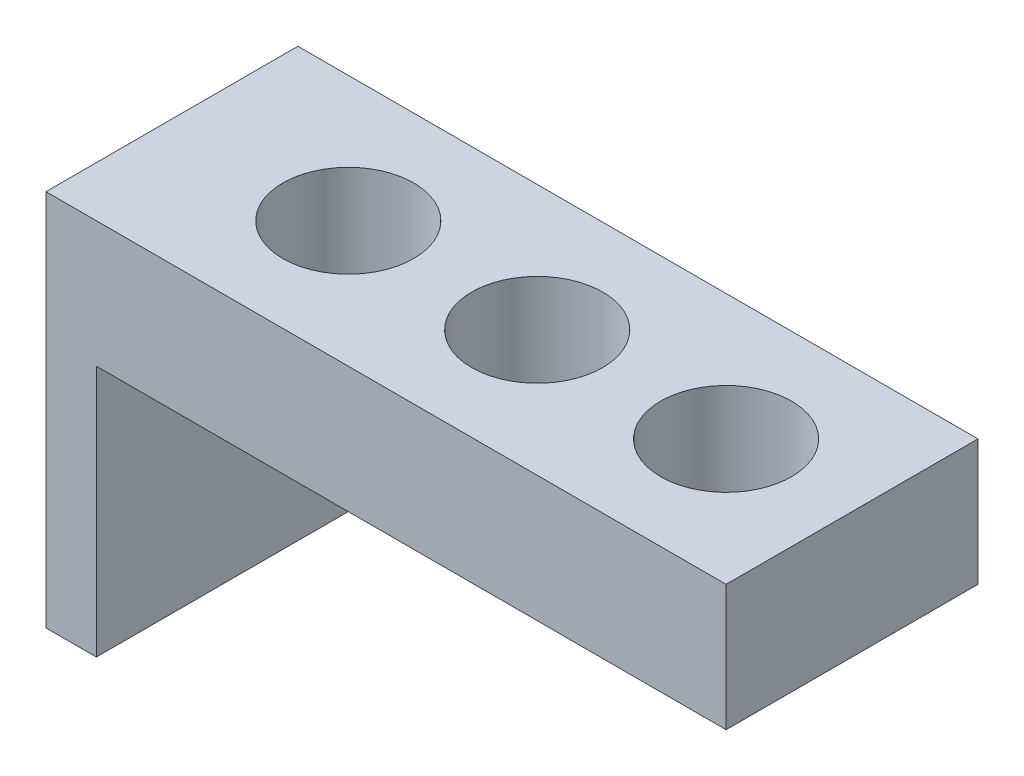
ISO-10303-21;
HEADER;
FILE_DESCRIPTION(('STEP AP214'),'2;1');
FILE_NAME('part.step','',(''),(''),'','','');
FILE_SCHEMA(('AUTOMOTIVE_DESIGN { 1 0 10303 214 1 1 1 1 }'));
ENDSEC;
DATA;
#1=APPLICATION_CONTEXT('core data for automotive mechanical design processes');
#2=APPLICATION_PROTOCOL_DEFINITION('international standard','automotive_design',2000,#1);
#3=PRODUCT_CONTEXT('',#1,'mechanical');
#4=PRODUCT('Part','Part','',(#3));
#5=PRODUCT_RELATED_PRODUCT_CATEGORY('part','',(#4));
#6=PRODUCT_DEFINITION_FORMATION('','',#4);
#7=PRODUCT_DEFINITION_CONTEXT('part definition',#1,'design');
#8=PRODUCT_DEFINITION('design','',#6,#7);
#9=PRODUCT_DEFINITION_SHAPE('','',#8);
#10=(LENGTH_UNIT() NAMED_UNIT(*) SI_UNIT(.MILLI.,.METRE.));
#11=(NAMED_UNIT(*) PLANE_ANGLE_UNIT() SI_UNIT($,.RADIAN.));
#12=(NAMED_UNIT(*) SI_UNIT($,.STERADIAN.) SOLID_ANGLE_UNIT());
#13=UNCERTAINTY_MEASURE_WITH_UNIT(LENGTH_MEASURE(1.E-05),#10,'distance_accuracy_value','');
#14=(GEOMETRIC_REPRESENTATION_CONTEXT(3) GLOBAL_UNCERTAINTY_ASSIGNED_CONTEXT((#13)) GLOBAL_UNIT_ASSIGNED_CONTEXT((#10,
#11,#12)) REPRESENTATION_CONTEXT('',''));
#15=CARTESIAN_POINT('',(0.,0.,0.));
#16=DIRECTION('',(0.,0.,1.));
#17=DIRECTION('',(1.,0.,0.));
#18=AXIS2_PLACEMENT_3D('',#15,#16,#17);
#19=CARTESIAN_POINT('',(0.,5.,0.));
#20=DIRECTION('',(0.,-1.,0.));
#21=DIRECTION('',(0.,0.,-1.));
#22=AXIS2_PLACEMENT_3D('',#19,#20,#21);
#23=PLANE('',#22);
#24=DIRECTION('',(0.,0.,-1.));
#25=VECTOR('',#24,1.);
#26=CARTESIAN_POINT('',(12.5,5.,5.));
#27=LINE('',#26,#25);
#28=CARTESIAN_POINT('',(12.5,5.,5.));
#29=VERTEX_POINT('',#28);
#30=CARTESIAN_POINT('',(12.5,5.,-5.));
#31=VERTEX_POINT('',#30);
#32=EDGE_CURVE('E79',#29,#31,#27,.T.);
#33=ORIENTED_EDGE('',*,*,#32,.T.);
#34=DIRECTION('',(-1.,0.,0.));
#35=VECTOR('',#34,1.);
#36=CARTESIAN_POINT('',(-12.5,5.,-5.));
#37=LINE('',#36,#35);
#38=CARTESIAN_POINT('',(-14.5,5.,-5.));
#39=VERTEX_POINT('',#38);
#40=EDGE_CURVE('E118',#31,#39,#37,.T.);
#41=ORIENTED_EDGE('',*,*,#40,.T.);
#42=DIRECTION('',(0.,0.,1.));
#43=VECTOR('',#42,1.);
#44=CARTESIAN_POINT('',(-14.5,5.,-5.));
#45=LINE('',#44,#43);
#46=CARTESIAN_POINT('',(-14.5,5.,5.));
#47=VERTEX_POINT('',#46);
#48=EDGE_CURVE('E121',#39,#47,#45,.T.);
#49=ORIENTED_EDGE('',*,*,#48,.T.);
#50=DIRECTION('',(1.,0.,0.));
#51=VECTOR('',#50,1.);
#52=CARTESIAN_POINT('',(-12.5,5.,5.));
#53=LINE('',#52,#51);
#54=EDGE_CURVE('E50',#47,#29,#53,.T.);
#55=ORIENTED_EDGE('',*,*,#54,.T.);
#56=EDGE_LOOP('',(#33,#41,#49,#55));
#57=FACE_BOUND('',#56,.T.);
#58=CARTESIAN_POINT('',(-7.5,5.,0.));
#59=DIRECTION('',(0.,1.,0.));
#60=DIRECTION('',(0.,0.,1.));
#61=AXIS2_PLACEMENT_3D('',#58,#59,#60);
#62=CIRCLE('',#61,2.6);
#63=CARTESIAN_POINT('',(-7.5,5.,2.6));
#64=VERTEX_POINT('',#63);
#65=EDGE_CURVE('E88',#64,#64,#62,.T.);
#66=ORIENTED_EDGE('',*,*,#65,.F.);
#67=EDGE_LOOP('',(#66));
#68=FACE_BOUND('',#67,.T.);
#69=CARTESIAN_POINT('',(0.,5.,0.));
#70=DIRECTION('',(0.,1.,0.));
#71=DIRECTION('',(0.,0.,1.));
#72=AXIS2_PLACEMENT_3D('',#69,#70,#71);
#73=CIRCLE('',#72,2.6);
#74=CARTESIAN_POINT('',(0.,5.,2.6));
#75=VERTEX_POINT('',#74);
#76=EDGE_CURVE('E154',#75,#75,#73,.T.);
#77=ORIENTED_EDGE('',*,*,#76,.F.);
#78=EDGE_LOOP('',(#77));
#79=FACE_BOUND('',#78,.T.);
#80=CARTESIAN_POINT('',(7.5,5.,0.));
#81=DIRECTION('',(0.,1.,0.));
#82=DIRECTION('',(0.,0.,1.));
#83=AXIS2_PLACEMENT_3D('',#80,#81,#82);
#84=CIRCLE('',#83,2.6);
#85=CARTESIAN_POINT('',(7.5,5.,2.6));
#86=VERTEX_POINT('',#85);
#87=EDGE_CURVE('E148',#86,#86,#84,.T.);
#88=ORIENTED_EDGE('',*,*,#87,.F.);
#89=EDGE_LOOP('',(#88));
#90=FACE_BOUND('',#89,.T.);
#91=ADVANCED_FACE('F33',(#57,#68,#79,#90),#23,.F.);
#92=CARTESIAN_POINT('',(0.,0.,0.));
#93=DIRECTION('',(0.,-1.,0.));
#94=DIRECTION('',(0.,0.,-1.));
#95=AXIS2_PLACEMENT_3D('',#92,#93,#94);
#96=PLANE('',#95);
#97=CARTESIAN_POINT('',(0.,0.,0.));
#98=DIRECTION('',(0.,1.,0.));
#99=DIRECTION('',(0.,0.,1.));
#100=AXIS2_PLACEMENT_3D('',#97,#98,#99);
#101=CIRCLE('',#100,2.6);
#102=CARTESIAN_POINT('',(0.,0.,2.6));
#103=VERTEX_POINT('',#102);
#104=EDGE_CURVE('E151',#103,#103,#101,.T.);
#105=ORIENTED_EDGE('',*,*,#104,.T.);
#106=EDGE_LOOP('',(#105));
#107=FACE_BOUND('',#106,.T.);
#108=DIRECTION('',(0.,0.,-1.));
#109=VECTOR('',#108,1.);
#110=CARTESIAN_POINT('',(12.5,0.,5.));
#111=LINE('',#110,#109);
#112=CARTESIAN_POINT('',(12.5,0.,5.));
#113=VERTEX_POINT('',#112);
#114=CARTESIAN_POINT('',(12.5,0.,-5.));
#115=VERTEX_POINT('',#114);
#116=EDGE_CURVE('E85',#113,#115,#111,.T.);
#117=ORIENTED_EDGE('',*,*,#116,.F.);
#118=DIRECTION('',(1.,0.,0.));
#119=VECTOR('',#118,1.);
#120=CARTESIAN_POINT('',(-12.5,0.,5.));
#121=LINE('',#120,#119);
#122=CARTESIAN_POINT('',(-12.5,0.,5.));
#123=VERTEX_POINT('',#122);
#124=EDGE_CURVE('E69',#123,#113,#121,.T.);
#125=ORIENTED_EDGE('',*,*,#124,.F.);
#126=DIRECTION('',(0.,0.,1.));
#127=VECTOR('',#126,1.);
#128=CARTESIAN_POINT('',(-12.5,0.,5.));
#129=LINE('',#128,#127);
#130=CARTESIAN_POINT('',(-12.5,0.,-5.));
#131=VERTEX_POINT('',#130);
#132=EDGE_CURVE('E80',#131,#123,#129,.T.);
#133=ORIENTED_EDGE('',*,*,#132,.F.);
#134=DIRECTION('',(-1.,0.,0.));
#135=VECTOR('',#134,1.);
#136=CARTESIAN_POINT('',(-12.5,0.,-5.));
#137=LINE('',#136,#135);
#138=EDGE_CURVE('E63',#115,#131,#137,.T.);
#139=ORIENTED_EDGE('',*,*,#138,.F.);
#140=EDGE_LOOP('',(#117,#125,#133,#139));
#141=FACE_BOUND('',#140,.T.);
#142=CARTESIAN_POINT('',(-7.5,0.,0.));
#143=DIRECTION('',(0.,1.,0.));
#144=DIRECTION('',(0.,0.,1.));
#145=AXIS2_PLACEMENT_3D('',#142,#143,#144);
#146=CIRCLE('',#145,2.6);
#147=CARTESIAN_POINT('',(-7.5,0.,2.6));
#148=VERTEX_POINT('',#147);
#149=EDGE_CURVE('E92',#148,#148,#146,.T.);
#150=ORIENTED_EDGE('',*,*,#149,.T.);
#151=EDGE_LOOP('',(#150));
#152=FACE_BOUND('',#151,.T.);
#153=CARTESIAN_POINT('',(7.5,0.,0.));
#154=DIRECTION('',(0.,1.,0.));
#155=DIRECTION('',(0.,0.,1.));
#156=AXIS2_PLACEMENT_3D('',#153,#154,#155);
#157=CIRCLE('',#156,2.6);
#158=CARTESIAN_POINT('',(7.5,0.,2.6));
#159=VERTEX_POINT('',#158);
#160=EDGE_CURVE('E146',#159,#159,#157,.T.);
#161=ORIENTED_EDGE('',*,*,#160,.T.);
#162=EDGE_LOOP('',(#161));
#163=FACE_BOUND('',#162,.T.);
#164=ADVANCED_FACE('F86',(#107,#141,#152,#163),#96,.T.);
#165=CARTESIAN_POINT('',(12.5,5.,5.));
#166=DIRECTION('',(-1.,0.,0.));
#167=DIRECTION('',(0.,0.,1.));
#168=AXIS2_PLACEMENT_3D('',#165,#166,#167);
#169=PLANE('',#168);
#170=ORIENTED_EDGE('',*,*,#116,.T.);
#171=DIRECTION('',(0.,-1.,0.));
#172=VECTOR('',#171,1.);
#173=CARTESIAN_POINT('',(12.5,5.,-5.));
#174=LINE('',#173,#172);
#175=EDGE_CURVE('E11',#31,#115,#174,.T.);
#176=ORIENTED_EDGE('',*,*,#175,.F.);
#177=ORIENTED_EDGE('',*,*,#32,.F.);
#178=DIRECTION('',(0.,-1.,0.));
#179=VECTOR('',#178,1.);
#180=CARTESIAN_POINT('',(12.5,5.,5.));
#181=LINE('',#180,#179);
#182=EDGE_CURVE('E42',#29,#113,#181,.T.);
#183=ORIENTED_EDGE('',*,*,#182,.T.);
#184=EDGE_LOOP('',(#170,#176,#177,#183));
#185=FACE_BOUND('',#184,.T.);
#186=ADVANCED_FACE('F35',(#185),#169,.F.);
#187=CARTESIAN_POINT('',(-12.5,5.,-5.));
#188=DIRECTION('',(0.,0.,1.));
#189=DIRECTION('',(1.,0.,0.));
#190=AXIS2_PLACEMENT_3D('',#187,#188,#189);
#191=PLANE('',#190);
#192=ORIENTED_EDGE('',*,*,#138,.T.);
#193=DIRECTION('',(0.,1.,0.));
#194=VECTOR('',#193,1.);
#195=CARTESIAN_POINT('',(-12.5,-10.,-5.));
#196=LINE('',#195,#194);
#197=CARTESIAN_POINT('',(-12.5,-10.,-5.));
#198=VERTEX_POINT('',#197);
#199=EDGE_CURVE('E102',#198,#131,#196,.T.);
#200=ORIENTED_EDGE('',*,*,#199,.F.);
#201=DIRECTION('',(1.,0.,0.));
#202=VECTOR('',#201,1.);
#203=CARTESIAN_POINT('',(-14.5,-10.,-5.));
#204=LINE('',#203,#202);
#205=CARTESIAN_POINT('',(-14.5,-10.,-5.));
#206=VERTEX_POINT('',#205);
#207=EDGE_CURVE('E132',#206,#198,#204,.T.);
#208=ORIENTED_EDGE('',*,*,#207,.F.);
#209=DIRECTION('',(0.,-1.,0.));
#210=VECTOR('',#209,1.);
#211=CARTESIAN_POINT('',(-14.5,5.,-5.));
#212=LINE('',#211,#210);
#213=EDGE_CURVE('E127',#39,#206,#212,.T.);
#214=ORIENTED_EDGE('',*,*,#213,.F.);
#215=ORIENTED_EDGE('',*,*,#40,.F.);
#216=ORIENTED_EDGE('',*,*,#175,.T.);
#217=EDGE_LOOP('',(#192,#200,#208,#214,#215,#216));
#218=FACE_BOUND('',#217,.T.);
#219=ADVANCED_FACE('F134',(#218),#191,.F.);
#220=CARTESIAN_POINT('',(-12.5,5.,5.));
#221=DIRECTION('',(0.,0.,-1.));
#222=DIRECTION('',(-1.,0.,0.));
#223=AXIS2_PLACEMENT_3D('',#220,#221,#222);
#224=PLANE('',#223);
#225=ORIENTED_EDGE('',*,*,#124,.T.);
#226=ORIENTED_EDGE('',*,*,#182,.F.);
#227=ORIENTED_EDGE('',*,*,#54,.F.);
#228=DIRECTION('',(0.,-1.,0.));
#229=VECTOR('',#228,1.);
#230=CARTESIAN_POINT('',(-14.5,5.,5.));
#231=LINE('',#230,#229);
#232=CARTESIAN_POINT('',(-14.5,-10.,5.));
#233=VERTEX_POINT('',#232);
#234=EDGE_CURVE('E130',#47,#233,#231,.T.);
#235=ORIENTED_EDGE('',*,*,#234,.T.);
#236=DIRECTION('',(1.,0.,0.));
#237=VECTOR('',#236,1.);
#238=CARTESIAN_POINT('',(-14.5,-10.,5.));
#239=LINE('',#238,#237);
#240=CARTESIAN_POINT('',(-12.5,-10.,5.));
#241=VERTEX_POINT('',#240);
#242=EDGE_CURVE('E138',#233,#241,#239,.T.);
#243=ORIENTED_EDGE('',*,*,#242,.T.);
#244=DIRECTION('',(0.,1.,0.));
#245=VECTOR('',#244,1.);
#246=CARTESIAN_POINT('',(-12.5,-10.,5.));
#247=LINE('',#246,#245);
#248=EDGE_CURVE('E75',#241,#123,#247,.T.);
#249=ORIENTED_EDGE('',*,*,#248,.T.);
#250=EDGE_LOOP('',(#225,#226,#227,#235,#243,#249));
#251=FACE_BOUND('',#250,.T.);
#252=ADVANCED_FACE('F71',(#251),#224,.F.);
#253=CARTESIAN_POINT('',(-7.5,5.,0.));
#254=DIRECTION('',(0.,-1.,0.));
#255=DIRECTION('',(0.,0.,-1.));
#256=AXIS2_PLACEMENT_3D('',#253,#254,#255);
#257=CYLINDRICAL_SURFACE('',#256,2.6);
#258=ORIENTED_EDGE('',*,*,#65,.T.);
#259=EDGE_LOOP('',(#258));
#260=FACE_BOUND('',#259,.T.);
#261=ORIENTED_EDGE('',*,*,#149,.F.);
#262=EDGE_LOOP('',(#261));
#263=FACE_BOUND('',#262,.T.);
#264=ADVANCED_FACE('F164',(#260,#263),#257,.F.);
#265=CARTESIAN_POINT('',(0.,5.,0.));
#266=DIRECTION('',(0.,-1.,0.));
#267=DIRECTION('',(0.,0.,-1.));
#268=AXIS2_PLACEMENT_3D('',#265,#266,#267);
#269=CYLINDRICAL_SURFACE('',#268,2.6);
#270=ORIENTED_EDGE('',*,*,#76,.T.);
#271=EDGE_LOOP('',(#270));
#272=FACE_BOUND('',#271,.T.);
#273=ORIENTED_EDGE('',*,*,#104,.F.);
#274=EDGE_LOOP('',(#273));
#275=FACE_BOUND('',#274,.T.);
#276=ADVANCED_FACE('F166',(#272,#275),#269,.F.);
#277=CARTESIAN_POINT('',(7.5,5.,0.));
#278=DIRECTION('',(0.,-1.,0.));
#279=DIRECTION('',(0.,0.,-1.));
#280=AXIS2_PLACEMENT_3D('',#277,#278,#279);
#281=CYLINDRICAL_SURFACE('',#280,2.6);
#282=ORIENTED_EDGE('',*,*,#87,.T.);
#283=EDGE_LOOP('',(#282));
#284=FACE_BOUND('',#283,.T.);
#285=ORIENTED_EDGE('',*,*,#160,.F.);
#286=EDGE_LOOP('',(#285));
#287=FACE_BOUND('',#286,.T.);
#288=ADVANCED_FACE('F173',(#284,#287),#281,.F.);
#289=CARTESIAN_POINT('',(-12.5,-10.,-5.));
#290=DIRECTION('',(1.,0.,0.));
#291=DIRECTION('',(0.,0.,-1.));
#292=AXIS2_PLACEMENT_3D('',#289,#290,#291);
#293=PLANE('',#292);
#294=ORIENTED_EDGE('',*,*,#199,.T.);
#295=ORIENTED_EDGE('',*,*,#132,.T.);
#296=ORIENTED_EDGE('',*,*,#248,.F.);
#297=DIRECTION('',(0.,0.,1.));
#298=VECTOR('',#297,1.);
#299=CARTESIAN_POINT('',(-12.5,-10.,-5.));
#300=LINE('',#299,#298);
#301=EDGE_CURVE('E144',#198,#241,#300,.T.);
#302=ORIENTED_EDGE('',*,*,#301,.F.);
#303=EDGE_LOOP('',(#294,#295,#296,#302));
#304=FACE_BOUND('',#303,.T.);
#305=ADVANCED_FACE('F99',(#304),#293,.T.);
#306=CARTESIAN_POINT('',(-14.5,-10.,-5.));
#307=DIRECTION('',(0.,-1.,0.));
#308=DIRECTION('',(1.,0.,0.));
#309=AXIS2_PLACEMENT_3D('',#306,#307,#308);
#310=PLANE('',#309);
#311=ORIENTED_EDGE('',*,*,#242,.F.);
#312=DIRECTION('',(0.,0.,1.));
#313=VECTOR('',#312,1.);
#314=CARTESIAN_POINT('',(-14.5,-10.,-5.));
#315=LINE('',#314,#313);
#316=EDGE_CURVE('E131',#206,#233,#315,.T.);
#317=ORIENTED_EDGE('',*,*,#316,.F.);
#318=ORIENTED_EDGE('',*,*,#207,.T.);
#319=ORIENTED_EDGE('',*,*,#301,.T.);
#320=EDGE_LOOP('',(#311,#317,#318,#319));
#321=FACE_BOUND('',#320,.T.);
#322=ADVANCED_FACE('F219',(#321),#310,.T.);
#323=CARTESIAN_POINT('',(-14.5,5.,-5.));
#324=DIRECTION('',(-1.,0.,0.));
#325=DIRECTION('',(0.,-1.,0.));
#326=AXIS2_PLACEMENT_3D('',#323,#324,#325);
#327=PLANE('',#326);
#328=ORIENTED_EDGE('',*,*,#234,.F.);
#329=ORIENTED_EDGE('',*,*,#48,.F.);
#330=ORIENTED_EDGE('',*,*,#213,.T.);
#331=ORIENTED_EDGE('',*,*,#316,.T.);
#332=EDGE_LOOP('',(#328,#329,#330,#331));
#333=FACE_BOUND('',#332,.T.);
#334=ADVANCED_FACE('F126',(#333),#327,.T.);
#335=CLOSED_SHELL('',(#91,#164,#186,#219,#252,#264,#276,#288,#305,#322,#334));
#336=MANIFOLD_SOLID_BREP('B2',#335);
#337=ADVANCED_BREP_SHAPE_REPRESENTATION('',(#18,#336),#14);
#338=SHAPE_DEFINITION_REPRESENTATION(#9,#337);
ENDSEC;
END-ISO-10303-21;
